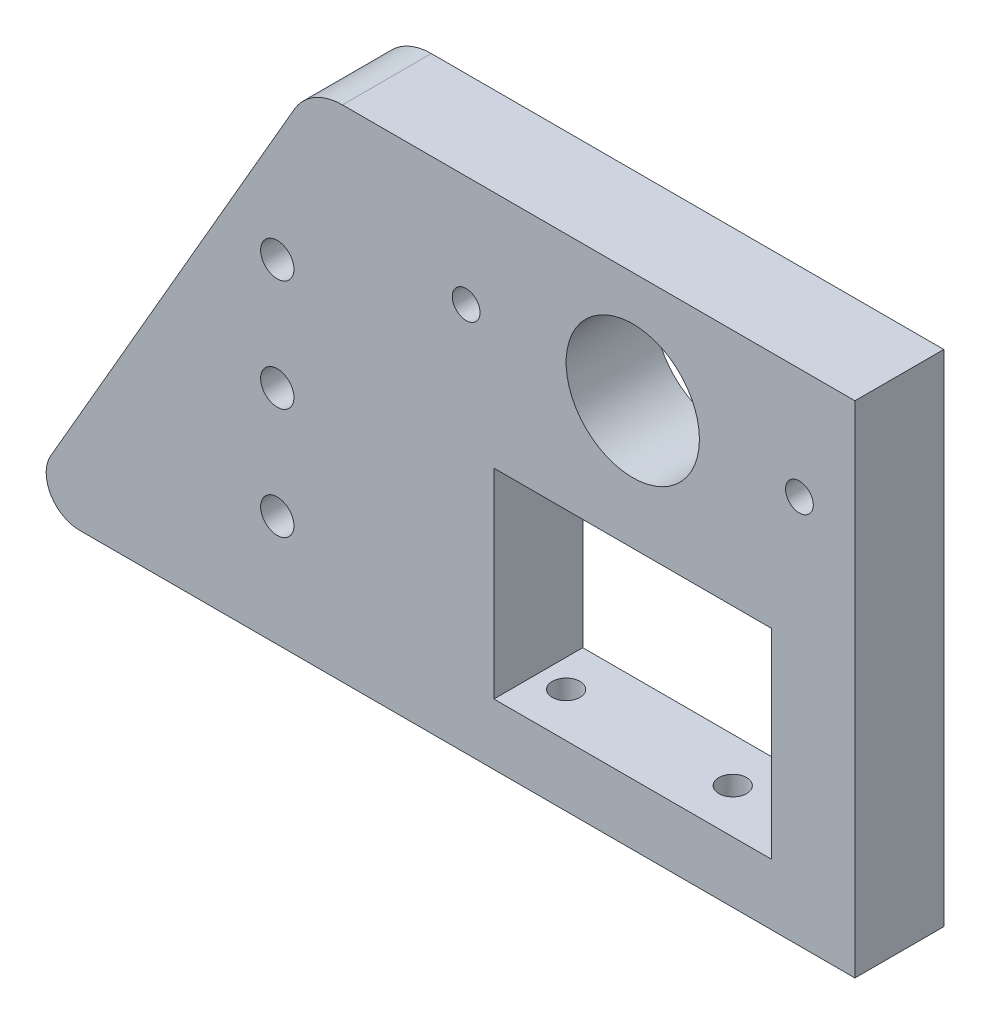
ISO-10303-21;
HEADER;
FILE_DESCRIPTION(('STEP AP214'),'2;1');
FILE_NAME('part.step','',(''),(''),'','','');
FILE_SCHEMA(('AUTOMOTIVE_DESIGN { 1 0 10303 214 1 1 1 1 }'));
ENDSEC;
DATA;
#1=APPLICATION_CONTEXT('core data for automotive mechanical design processes');
#2=APPLICATION_PROTOCOL_DEFINITION('international standard','automotive_design',2000,#1);
#3=PRODUCT_CONTEXT('',#1,'mechanical');
#4=PRODUCT('Part','Part','',(#3));
#5=PRODUCT_RELATED_PRODUCT_CATEGORY('part','',(#4));
#6=PRODUCT_DEFINITION_FORMATION('','',#4);
#7=PRODUCT_DEFINITION_CONTEXT('part definition',#1,'design');
#8=PRODUCT_DEFINITION('design','',#6,#7);
#9=PRODUCT_DEFINITION_SHAPE('','',#8);
#10=(LENGTH_UNIT() NAMED_UNIT(*) SI_UNIT(.MILLI.,.METRE.));
#11=(NAMED_UNIT(*) PLANE_ANGLE_UNIT() SI_UNIT($,.RADIAN.));
#12=(NAMED_UNIT(*) SI_UNIT($,.STERADIAN.) SOLID_ANGLE_UNIT());
#13=UNCERTAINTY_MEASURE_WITH_UNIT(LENGTH_MEASURE(1.E-05),#10,'distance_accuracy_value','');
#14=(GEOMETRIC_REPRESENTATION_CONTEXT(3) GLOBAL_UNCERTAINTY_ASSIGNED_CONTEXT((#13)) GLOBAL_UNIT_ASSIGNED_CONTEXT((#10,
#11,#12)) REPRESENTATION_CONTEXT('',''));
#15=CARTESIAN_POINT('',(0.,0.,0.));
#16=DIRECTION('',(0.,0.,1.));
#17=DIRECTION('',(1.,0.,0.));
#18=AXIS2_PLACEMENT_3D('',#15,#16,#17);
#19=CARTESIAN_POINT('',(-49.8038475772934,-32.,8.));
#20=DIRECTION('',(0.,0.,-1.));
#21=DIRECTION('',(-1.,0.,0.));
#22=AXIS2_PLACEMENT_3D('',#19,#20,#21);
#23=CYLINDRICAL_SURFACE('',#22,2.99999999999999);
#24=CARTESIAN_POINT('',(-49.8038475772934,-32.,0.));
#25=DIRECTION('',(0.,0.,1.));
#26=DIRECTION('',(1.,0.,0.));
#27=AXIS2_PLACEMENT_3D('',#24,#25,#26);
#28=CIRCLE('',#27,2.99999999999999);
#29=CARTESIAN_POINT('',(-49.8038475772934,-35.,0.));
#30=VERTEX_POINT('',#29);
#31=CARTESIAN_POINT('',(-52.4019237886466,-30.5,0.));
#32=VERTEX_POINT('',#31);
#33=EDGE_CURVE('E177',#30,#32,#28,.F.);
#34=ORIENTED_EDGE('',*,*,#33,.F.);
#35=DIRECTION('',(0.,0.,-1.));
#36=VECTOR('',#35,1.);
#37=CARTESIAN_POINT('',(-49.8038475772934,-35.,8.));
#38=LINE('',#37,#36);
#39=CARTESIAN_POINT('',(-49.8038475772934,-35.,8.));
#40=VERTEX_POINT('',#39);
#41=EDGE_CURVE('E11',#40,#30,#38,.T.);
#42=ORIENTED_EDGE('',*,*,#41,.F.);
#43=CARTESIAN_POINT('',(-49.8038475772934,-32.,8.));
#44=DIRECTION('',(0.,0.,1.));
#45=DIRECTION('',(1.,0.,0.));
#46=AXIS2_PLACEMENT_3D('',#43,#44,#45);
#47=CIRCLE('',#46,2.99999999999999);
#48=CARTESIAN_POINT('',(-52.4019237886466,-30.5,8.));
#49=VERTEX_POINT('',#48);
#50=EDGE_CURVE('E236',#40,#49,#47,.F.);
#51=ORIENTED_EDGE('',*,*,#50,.T.);
#52=DIRECTION('',(0.,0.,-1.));
#53=VECTOR('',#52,1.);
#54=CARTESIAN_POINT('',(-52.4019237886466,-30.5,8.));
#55=LINE('',#54,#53);
#56=EDGE_CURVE('E57',#49,#32,#55,.T.);
#57=ORIENTED_EDGE('',*,*,#56,.T.);
#58=EDGE_LOOP('',(#34,#42,#51,#57));
#59=FACE_BOUND('',#58,.T.);
#60=ADVANCED_FACE('F38',(#59),#23,.T.);
#61=CARTESIAN_POINT('',(0.,-35.,8.));
#62=DIRECTION('',(0.,1.,0.));
#63=DIRECTION('',(0.,0.,1.));
#64=AXIS2_PLACEMENT_3D('',#61,#62,#63);
#65=PLANE('',#64);
#66=CARTESIAN_POINT('',(-25.,-35.,4.));
#67=DIRECTION('',(0.,-1.,0.));
#68=DIRECTION('',(0.,0.,-1.));
#69=AXIS2_PLACEMENT_3D('',#66,#67,#68);
#70=CIRCLE('',#69,1.525);
#71=CARTESIAN_POINT('',(-25.,-35.,2.475));
#72=VERTEX_POINT('',#71);
#73=EDGE_CURVE('E389',#72,#72,#70,.T.);
#74=ORIENTED_EDGE('',*,*,#73,.F.);
#75=EDGE_LOOP('',(#74));
#76=FACE_BOUND('',#75,.T.);
#77=CARTESIAN_POINT('',(5.,-35.,4.));
#78=DIRECTION('',(0.,-1.,0.));
#79=DIRECTION('',(0.,0.,-1.));
#80=AXIS2_PLACEMENT_3D('',#77,#78,#79);
#81=CIRCLE('',#80,1.525);
#82=CARTESIAN_POINT('',(5.,-35.,2.475));
#83=VERTEX_POINT('',#82);
#84=EDGE_CURVE('E398',#83,#83,#81,.T.);
#85=ORIENTED_EDGE('',*,*,#84,.F.);
#86=EDGE_LOOP('',(#85));
#87=FACE_BOUND('',#86,.T.);
#88=CARTESIAN_POINT('',(-10.,-35.,4.));
#89=DIRECTION('',(0.,-1.,0.));
#90=DIRECTION('',(0.,0.,-1.));
#91=AXIS2_PLACEMENT_3D('',#88,#89,#90);
#92=CIRCLE('',#91,1.525);
#93=CARTESIAN_POINT('',(-10.,-35.,2.475));
#94=VERTEX_POINT('',#93);
#95=EDGE_CURVE('E207',#94,#94,#92,.T.);
#96=ORIENTED_EDGE('',*,*,#95,.F.);
#97=EDGE_LOOP('',(#96));
#98=FACE_BOUND('',#97,.T.);
#99=DIRECTION('',(1.,0.,0.));
#100=VECTOR('',#99,1.);
#101=CARTESIAN_POINT('',(0.,-35.,0.));
#102=LINE('',#101,#100);
#103=CARTESIAN_POINT('',(20.,-35.,0.));
#104=VERTEX_POINT('',#103);
#105=EDGE_CURVE('E179',#30,#104,#102,.T.);
#106=ORIENTED_EDGE('',*,*,#105,.T.);
#107=DIRECTION('',(0.,0.,-1.));
#108=VECTOR('',#107,1.);
#109=CARTESIAN_POINT('',(20.,-35.,8.));
#110=LINE('',#109,#108);
#111=CARTESIAN_POINT('',(20.,-35.,8.));
#112=VERTEX_POINT('',#111);
#113=EDGE_CURVE('E48',#112,#104,#110,.T.);
#114=ORIENTED_EDGE('',*,*,#113,.F.);
#115=DIRECTION('',(1.,0.,0.));
#116=VECTOR('',#115,1.);
#117=CARTESIAN_POINT('',(0.,-35.,8.));
#118=LINE('',#117,#116);
#119=EDGE_CURVE('E238',#40,#112,#118,.T.);
#120=ORIENTED_EDGE('',*,*,#119,.F.);
#121=ORIENTED_EDGE('',*,*,#41,.T.);
#122=EDGE_LOOP('',(#106,#114,#120,#121));
#123=FACE_BOUND('',#122,.T.);
#124=ADVANCED_FACE('F262',(#76,#87,#98,#123),#65,.F.);
#125=CARTESIAN_POINT('',(20.,0.,8.));
#126=DIRECTION('',(1.,0.,0.));
#127=DIRECTION('',(0.,1.,0.));
#128=AXIS2_PLACEMENT_3D('',#125,#126,#127);
#129=PLANE('',#128);
#130=DIRECTION('',(0.,-1.,0.));
#131=VECTOR('',#130,1.);
#132=CARTESIAN_POINT('',(20.,0.,0.));
#133=LINE('',#132,#131);
#134=CARTESIAN_POINT('',(20.,10.,0.));
#135=VERTEX_POINT('',#134);
#136=EDGE_CURVE('E182',#135,#104,#133,.T.);
#137=ORIENTED_EDGE('',*,*,#136,.F.);
#138=DIRECTION('',(0.,0.,-1.));
#139=VECTOR('',#138,1.);
#140=CARTESIAN_POINT('',(20.,10.,8.));
#141=LINE('',#140,#139);
#142=CARTESIAN_POINT('',(20.,10.,8.));
#143=VERTEX_POINT('',#142);
#144=EDGE_CURVE('E134',#143,#135,#141,.T.);
#145=ORIENTED_EDGE('',*,*,#144,.F.);
#146=DIRECTION('',(0.,-1.,0.));
#147=VECTOR('',#146,1.);
#148=CARTESIAN_POINT('',(20.,0.,8.));
#149=LINE('',#148,#147);
#150=EDGE_CURVE('E144',#143,#112,#149,.T.);
#151=ORIENTED_EDGE('',*,*,#150,.T.);
#152=ORIENTED_EDGE('',*,*,#113,.T.);
#153=EDGE_LOOP('',(#137,#145,#151,#152));
#154=FACE_BOUND('',#153,.T.);
#155=ADVANCED_FACE('F241',(#154),#129,.T.);
#156=CARTESIAN_POINT('',(0.,10.,8.));
#157=DIRECTION('',(0.,1.,0.));
#158=DIRECTION('',(0.,0.,1.));
#159=AXIS2_PLACEMENT_3D('',#156,#157,#158);
#160=PLANE('',#159);
#161=DIRECTION('',(1.,0.,0.));
#162=VECTOR('',#161,1.);
#163=CARTESIAN_POINT('',(0.,10.,0.));
#164=LINE('',#163,#162);
#165=CARTESIAN_POINT('',(-26.1324865405185,10.,0.));
#166=VERTEX_POINT('',#165);
#167=EDGE_CURVE('E130',#166,#135,#164,.T.);
#168=ORIENTED_EDGE('',*,*,#167,.F.);
#169=DIRECTION('',(0.,0.,-1.));
#170=VECTOR('',#169,1.);
#171=CARTESIAN_POINT('',(-26.1324865405185,10.,8.));
#172=LINE('',#171,#170);
#173=CARTESIAN_POINT('',(-26.1324865405185,10.,8.));
#174=VERTEX_POINT('',#173);
#175=EDGE_CURVE('E125',#174,#166,#172,.T.);
#176=ORIENTED_EDGE('',*,*,#175,.F.);
#177=DIRECTION('',(1.,0.,0.));
#178=VECTOR('',#177,1.);
#179=CARTESIAN_POINT('',(0.,10.,8.));
#180=LINE('',#179,#178);
#181=EDGE_CURVE('E128',#174,#143,#180,.T.);
#182=ORIENTED_EDGE('',*,*,#181,.T.);
#183=ORIENTED_EDGE('',*,*,#144,.T.);
#184=EDGE_LOOP('',(#168,#176,#182,#183));
#185=FACE_BOUND('',#184,.T.);
#186=ADVANCED_FACE('F127',(#185),#160,.T.);
#187=CARTESIAN_POINT('',(-26.1324865405185,5.,8.));
#188=DIRECTION('',(0.,0.,-1.));
#189=DIRECTION('',(-1.,0.,0.));
#190=AXIS2_PLACEMENT_3D('',#187,#188,#189);
#191=CYLINDRICAL_SURFACE('',#190,5.);
#192=CARTESIAN_POINT('',(-26.1324865405185,5.,0.));
#193=DIRECTION('',(0.,0.,1.));
#194=DIRECTION('',(1.,0.,0.));
#195=AXIS2_PLACEMENT_3D('',#192,#193,#194);
#196=CIRCLE('',#195,5.);
#197=CARTESIAN_POINT('',(-30.4626135594406,7.50000000000002,0.));
#198=VERTEX_POINT('',#197);
#199=EDGE_CURVE('E186',#198,#166,#196,.F.);
#200=ORIENTED_EDGE('',*,*,#199,.F.);
#201=DIRECTION('',(0.,0.,-1.));
#202=VECTOR('',#201,1.);
#203=CARTESIAN_POINT('',(-30.4626135594406,7.50000000000002,8.));
#204=LINE('',#203,#202);
#205=CARTESIAN_POINT('',(-30.4626135594406,7.50000000000002,8.));
#206=VERTEX_POINT('',#205);
#207=EDGE_CURVE('E89',#206,#198,#204,.T.);
#208=ORIENTED_EDGE('',*,*,#207,.F.);
#209=CARTESIAN_POINT('',(-26.1324865405185,5.,8.));
#210=DIRECTION('',(0.,0.,1.));
#211=DIRECTION('',(1.,0.,0.));
#212=AXIS2_PLACEMENT_3D('',#209,#210,#211);
#213=CIRCLE('',#212,5.);
#214=EDGE_CURVE('E142',#206,#174,#213,.F.);
#215=ORIENTED_EDGE('',*,*,#214,.T.);
#216=ORIENTED_EDGE('',*,*,#175,.T.);
#217=EDGE_LOOP('',(#200,#208,#215,#216));
#218=FACE_BOUND('',#217,.T.);
#219=ADVANCED_FACE('F146',(#218),#191,.T.);
#220=CARTESIAN_POINT('',(-12.5,0.,8.));
#221=DIRECTION('',(-1.,0.,0.));
#222=DIRECTION('',(0.,0.,1.));
#223=AXIS2_PLACEMENT_3D('',#220,#221,#222);
#224=PLANE('',#223);
#225=DIRECTION('',(0.,1.,0.));
#226=VECTOR('',#225,1.);
#227=CARTESIAN_POINT('',(-12.5,0.,0.));
#228=LINE('',#227,#226);
#229=CARTESIAN_POINT('',(-12.5,-29.5,0.));
#230=VERTEX_POINT('',#229);
#231=CARTESIAN_POINT('',(-12.5,-11.5,0.));
#232=VERTEX_POINT('',#231);
#233=EDGE_CURVE('E153',#230,#232,#228,.T.);
#234=ORIENTED_EDGE('',*,*,#233,.T.);
#235=DIRECTION('',(0.,0.,-1.));
#236=VECTOR('',#235,1.);
#237=CARTESIAN_POINT('',(-12.5,-11.5,8.));
#238=LINE('',#237,#236);
#239=CARTESIAN_POINT('',(-12.5,-11.5,8.));
#240=VERTEX_POINT('',#239);
#241=EDGE_CURVE('E192',#240,#232,#238,.T.);
#242=ORIENTED_EDGE('',*,*,#241,.F.);
#243=DIRECTION('',(0.,1.,0.));
#244=VECTOR('',#243,1.);
#245=CARTESIAN_POINT('',(-12.5,0.,8.));
#246=LINE('',#245,#244);
#247=CARTESIAN_POINT('',(-12.5,-29.5,8.));
#248=VERTEX_POINT('',#247);
#249=EDGE_CURVE('E102',#248,#240,#246,.T.);
#250=ORIENTED_EDGE('',*,*,#249,.F.);
#251=DIRECTION('',(0.,0.,-1.));
#252=VECTOR('',#251,1.);
#253=CARTESIAN_POINT('',(-12.5,-29.5,8.));
#254=LINE('',#253,#252);
#255=EDGE_CURVE('E149',#248,#230,#254,.T.);
#256=ORIENTED_EDGE('',*,*,#255,.T.);
#257=EDGE_LOOP('',(#234,#242,#250,#256));
#258=FACE_BOUND('',#257,.T.);
#259=ADVANCED_FACE('F40',(#258),#224,.F.);
#260=CARTESIAN_POINT('',(0.,-11.5,8.));
#261=DIRECTION('',(0.,-1.,0.));
#262=DIRECTION('',(1.,0.,0.));
#263=AXIS2_PLACEMENT_3D('',#260,#261,#262);
#264=PLANE('',#263);
#265=DIRECTION('',(-1.,0.,0.));
#266=VECTOR('',#265,1.);
#267=CARTESIAN_POINT('',(0.,-11.5,0.));
#268=LINE('',#267,#266);
#269=CARTESIAN_POINT('',(12.5,-11.5,0.));
#270=VERTEX_POINT('',#269);
#271=EDGE_CURVE('E156',#270,#232,#268,.T.);
#272=ORIENTED_EDGE('',*,*,#271,.F.);
#273=DIRECTION('',(0.,0.,-1.));
#274=VECTOR('',#273,1.);
#275=CARTESIAN_POINT('',(12.5,-11.5,8.));
#276=LINE('',#275,#274);
#277=CARTESIAN_POINT('',(12.5,-11.5,8.));
#278=VERTEX_POINT('',#277);
#279=EDGE_CURVE('E200',#278,#270,#276,.T.);
#280=ORIENTED_EDGE('',*,*,#279,.F.);
#281=DIRECTION('',(-1.,0.,0.));
#282=VECTOR('',#281,1.);
#283=CARTESIAN_POINT('',(0.,-11.5,8.));
#284=LINE('',#283,#282);
#285=EDGE_CURVE('E216',#278,#240,#284,.T.);
#286=ORIENTED_EDGE('',*,*,#285,.T.);
#287=ORIENTED_EDGE('',*,*,#241,.T.);
#288=EDGE_LOOP('',(#272,#280,#286,#287));
#289=FACE_BOUND('',#288,.T.);
#290=ADVANCED_FACE('F288',(#289),#264,.T.);
#291=CARTESIAN_POINT('',(12.5,0.,8.));
#292=DIRECTION('',(-1.,0.,0.));
#293=DIRECTION('',(0.,0.,1.));
#294=AXIS2_PLACEMENT_3D('',#291,#292,#293);
#295=PLANE('',#294);
#296=DIRECTION('',(0.,1.,0.));
#297=VECTOR('',#296,1.);
#298=CARTESIAN_POINT('',(12.5,0.,0.));
#299=LINE('',#298,#297);
#300=CARTESIAN_POINT('',(12.5,-29.5,0.));
#301=VERTEX_POINT('',#300);
#302=EDGE_CURVE('E160',#301,#270,#299,.T.);
#303=ORIENTED_EDGE('',*,*,#302,.F.);
#304=DIRECTION('',(0.,0.,-1.));
#305=VECTOR('',#304,1.);
#306=CARTESIAN_POINT('',(12.5,-29.5,8.));
#307=LINE('',#306,#305);
#308=CARTESIAN_POINT('',(12.5,-29.5,8.));
#309=VERTEX_POINT('',#308);
#310=EDGE_CURVE('E198',#309,#301,#307,.T.);
#311=ORIENTED_EDGE('',*,*,#310,.F.);
#312=DIRECTION('',(0.,1.,0.));
#313=VECTOR('',#312,1.);
#314=CARTESIAN_POINT('',(12.5,0.,8.));
#315=LINE('',#314,#313);
#316=EDGE_CURVE('E219',#309,#278,#315,.T.);
#317=ORIENTED_EDGE('',*,*,#316,.T.);
#318=ORIENTED_EDGE('',*,*,#279,.T.);
#319=EDGE_LOOP('',(#303,#311,#317,#318));
#320=FACE_BOUND('',#319,.T.);
#321=ADVANCED_FACE('F275',(#320),#295,.T.);
#322=CARTESIAN_POINT('',(0.,0.,8.));
#323=DIRECTION('',(0.,0.,-1.));
#324=DIRECTION('',(-1.,0.,0.));
#325=AXIS2_PLACEMENT_3D('',#322,#323,#324);
#326=CYLINDRICAL_SURFACE('',#325,6.);
#327=CARTESIAN_POINT('',(0.,0.,8.));
#328=DIRECTION('',(0.,0.,1.));
#329=DIRECTION('',(1.,0.,0.));
#330=AXIS2_PLACEMENT_3D('',#327,#328,#329);
#331=CIRCLE('',#330,6.);
#332=CARTESIAN_POINT('',(6.,0.,8.));
#333=VERTEX_POINT('',#332);
#334=EDGE_CURVE('E233',#333,#333,#331,.T.);
#335=ORIENTED_EDGE('',*,*,#334,.T.);
#336=EDGE_LOOP('',(#335));
#337=FACE_BOUND('',#336,.T.);
#338=CARTESIAN_POINT('',(0.,0.,0.));
#339=DIRECTION('',(0.,0.,1.));
#340=DIRECTION('',(1.,0.,0.));
#341=AXIS2_PLACEMENT_3D('',#338,#339,#340);
#342=CIRCLE('',#341,6.);
#343=CARTESIAN_POINT('',(6.,0.,0.));
#344=VERTEX_POINT('',#343);
#345=EDGE_CURVE('E174',#344,#344,#342,.T.);
#346=ORIENTED_EDGE('',*,*,#345,.F.);
#347=EDGE_LOOP('',(#346));
#348=FACE_BOUND('',#347,.T.);
#349=ADVANCED_FACE('F271',(#337,#348),#326,.F.);
#350=CARTESIAN_POINT('',(-32.,-5.00000000000001,8.));
#351=DIRECTION('',(0.,0.,-1.));
#352=DIRECTION('',(-1.,0.,0.));
#353=AXIS2_PLACEMENT_3D('',#350,#351,#352);
#354=CYLINDRICAL_SURFACE('',#353,1.5);
#355=CARTESIAN_POINT('',(-32.,-5.00000000000001,8.));
#356=DIRECTION('',(0.,0.,1.));
#357=DIRECTION('',(1.,0.,0.));
#358=AXIS2_PLACEMENT_3D('',#355,#356,#357);
#359=CIRCLE('',#358,1.5);
#360=CARTESIAN_POINT('',(-30.5,-5.00000000000001,8.));
#361=VERTEX_POINT('',#360);
#362=EDGE_CURVE('E230',#361,#361,#359,.T.);
#363=ORIENTED_EDGE('',*,*,#362,.T.);
#364=EDGE_LOOP('',(#363));
#365=FACE_BOUND('',#364,.T.);
#366=CARTESIAN_POINT('',(-32.,-5.00000000000001,0.));
#367=DIRECTION('',(0.,0.,1.));
#368=DIRECTION('',(1.,0.,0.));
#369=AXIS2_PLACEMENT_3D('',#366,#367,#368);
#370=CIRCLE('',#369,1.5);
#371=CARTESIAN_POINT('',(-30.5,-5.00000000000001,0.));
#372=VERTEX_POINT('',#371);
#373=EDGE_CURVE('E171',#372,#372,#370,.T.);
#374=ORIENTED_EDGE('',*,*,#373,.F.);
#375=EDGE_LOOP('',(#374));
#376=FACE_BOUND('',#375,.T.);
#377=ADVANCED_FACE('F274',(#365,#376),#354,.F.);
#378=CARTESIAN_POINT('',(-32.,-15.,8.));
#379=DIRECTION('',(0.,0.,-1.));
#380=DIRECTION('',(-1.,0.,0.));
#381=AXIS2_PLACEMENT_3D('',#378,#379,#380);
#382=CYLINDRICAL_SURFACE('',#381,1.5);
#383=CARTESIAN_POINT('',(-32.,-15.,8.));
#384=DIRECTION('',(0.,0.,1.));
#385=DIRECTION('',(1.,0.,0.));
#386=AXIS2_PLACEMENT_3D('',#383,#384,#385);
#387=CIRCLE('',#386,1.5);
#388=CARTESIAN_POINT('',(-30.5,-15.,8.));
#389=VERTEX_POINT('',#388);
#390=EDGE_CURVE('E227',#389,#389,#387,.T.);
#391=ORIENTED_EDGE('',*,*,#390,.T.);
#392=EDGE_LOOP('',(#391));
#393=FACE_BOUND('',#392,.T.);
#394=CARTESIAN_POINT('',(-32.,-15.,0.));
#395=DIRECTION('',(0.,0.,1.));
#396=DIRECTION('',(1.,0.,0.));
#397=AXIS2_PLACEMENT_3D('',#394,#395,#396);
#398=CIRCLE('',#397,1.5);
#399=CARTESIAN_POINT('',(-30.5,-15.,0.));
#400=VERTEX_POINT('',#399);
#401=EDGE_CURVE('E168',#400,#400,#398,.T.);
#402=ORIENTED_EDGE('',*,*,#401,.F.);
#403=EDGE_LOOP('',(#402));
#404=FACE_BOUND('',#403,.T.);
#405=ADVANCED_FACE('F279',(#393,#404),#382,.F.);
#406=CARTESIAN_POINT('',(-32.,-25.,8.));
#407=DIRECTION('',(0.,0.,-1.));
#408=DIRECTION('',(-1.,0.,0.));
#409=AXIS2_PLACEMENT_3D('',#406,#407,#408);
#410=CYLINDRICAL_SURFACE('',#409,1.5);
#411=CARTESIAN_POINT('',(-32.,-25.,8.));
#412=DIRECTION('',(0.,0.,1.));
#413=DIRECTION('',(1.,0.,0.));
#414=AXIS2_PLACEMENT_3D('',#411,#412,#413);
#415=CIRCLE('',#414,1.5);
#416=CARTESIAN_POINT('',(-30.5,-25.,8.));
#417=VERTEX_POINT('',#416);
#418=EDGE_CURVE('E224',#417,#417,#415,.T.);
#419=ORIENTED_EDGE('',*,*,#418,.T.);
#420=EDGE_LOOP('',(#419));
#421=FACE_BOUND('',#420,.T.);
#422=CARTESIAN_POINT('',(-32.,-25.,0.));
#423=DIRECTION('',(0.,0.,1.));
#424=DIRECTION('',(1.,0.,0.));
#425=AXIS2_PLACEMENT_3D('',#422,#423,#424);
#426=CIRCLE('',#425,1.5);
#427=CARTESIAN_POINT('',(-30.5,-25.,0.));
#428=VERTEX_POINT('',#427);
#429=EDGE_CURVE('E165',#428,#428,#426,.T.);
#430=ORIENTED_EDGE('',*,*,#429,.F.);
#431=EDGE_LOOP('',(#430));
#432=FACE_BOUND('',#431,.T.);
#433=ADVANCED_FACE('F256',(#421,#432),#410,.F.);
#434=CARTESIAN_POINT('',(0.,-29.5,8.));
#435=DIRECTION('',(0.,-1.,0.));
#436=DIRECTION('',(1.,0.,0.));
#437=AXIS2_PLACEMENT_3D('',#434,#435,#436);
#438=PLANE('',#437);
#439=CARTESIAN_POINT('',(5.,-29.5,4.));
#440=DIRECTION('',(0.,-1.,0.));
#441=DIRECTION('',(1.,0.,0.));
#442=AXIS2_PLACEMENT_3D('',#439,#440,#441);
#443=CIRCLE('',#442,1.25);
#444=CARTESIAN_POINT('',(6.25,-29.5,4.));
#445=VERTEX_POINT('',#444);
#446=EDGE_CURVE('E42',#445,#445,#443,.T.);
#447=ORIENTED_EDGE('',*,*,#446,.T.);
#448=EDGE_LOOP('',(#447));
#449=FACE_BOUND('',#448,.T.);
#450=CARTESIAN_POINT('',(-10.,-29.5,4.));
#451=DIRECTION('',(0.,-1.,0.));
#452=DIRECTION('',(1.,0.,0.));
#453=AXIS2_PLACEMENT_3D('',#450,#451,#452);
#454=CIRCLE('',#453,1.25);
#455=CARTESIAN_POINT('',(-8.75,-29.5,4.));
#456=VERTEX_POINT('',#455);
#457=EDGE_CURVE('E157',#456,#456,#454,.T.);
#458=ORIENTED_EDGE('',*,*,#457,.T.);
#459=EDGE_LOOP('',(#458));
#460=FACE_BOUND('',#459,.T.);
#461=DIRECTION('',(-1.,0.,0.));
#462=VECTOR('',#461,1.);
#463=CARTESIAN_POINT('',(0.,-29.5,0.));
#464=LINE('',#463,#462);
#465=EDGE_CURVE('E163',#301,#230,#464,.T.);
#466=ORIENTED_EDGE('',*,*,#465,.T.);
#467=ORIENTED_EDGE('',*,*,#255,.F.);
#468=DIRECTION('',(-1.,0.,0.));
#469=VECTOR('',#468,1.);
#470=CARTESIAN_POINT('',(0.,-29.5,8.));
#471=LINE('',#470,#469);
#472=EDGE_CURVE('E222',#309,#248,#471,.T.);
#473=ORIENTED_EDGE('',*,*,#472,.F.);
#474=ORIENTED_EDGE('',*,*,#310,.T.);
#475=EDGE_LOOP('',(#466,#467,#473,#474));
#476=FACE_BOUND('',#475,.T.);
#477=ADVANCED_FACE('F248',(#449,#460,#476),#438,.F.);
#478=CARTESIAN_POINT('',(-26.094555433772,15.065698604072,8.));
#479=DIRECTION('',(-0.866025403784436,0.500000000000004,0.));
#480=DIRECTION('',(-0.500000000000004,-0.866025403784436,0.));
#481=AXIS2_PLACEMENT_3D('',#478,#479,#480);
#482=PLANE('',#481);
#483=DIRECTION('',(0.500000000000004,0.866025403784436,0.));
#484=VECTOR('',#483,1.);
#485=CARTESIAN_POINT('',(-26.094555433772,15.065698604072,0.));
#486=LINE('',#485,#484);
#487=EDGE_CURVE('E188',#32,#198,#486,.T.);
#488=ORIENTED_EDGE('',*,*,#487,.F.);
#489=ORIENTED_EDGE('',*,*,#56,.F.);
#490=DIRECTION('',(0.500000000000004,0.866025403784436,0.));
#491=VECTOR('',#490,1.);
#492=CARTESIAN_POINT('',(-26.094555433772,15.065698604072,8.));
#493=LINE('',#492,#491);
#494=EDGE_CURVE('E147',#49,#206,#493,.T.);
#495=ORIENTED_EDGE('',*,*,#494,.T.);
#496=ORIENTED_EDGE('',*,*,#207,.T.);
#497=EDGE_LOOP('',(#488,#489,#495,#496));
#498=FACE_BOUND('',#497,.T.);
#499=ADVANCED_FACE('F246',(#498),#482,.T.);
#500=CARTESIAN_POINT('',(0.,0.,8.));
#501=DIRECTION('',(0.,0.,1.));
#502=DIRECTION('',(1.,0.,0.));
#503=AXIS2_PLACEMENT_3D('',#500,#501,#502);
#504=PLANE('',#503);
#505=CARTESIAN_POINT('',(-15.,0.,8.));
#506=DIRECTION('',(0.,0.,-1.));
#507=DIRECTION('',(-1.,0.,0.));
#508=AXIS2_PLACEMENT_3D('',#505,#506,#507);
#509=CIRCLE('',#508,1.25);
#510=CARTESIAN_POINT('',(-16.25,0.,8.));
#511=VERTEX_POINT('',#510);
#512=EDGE_CURVE('E375',#511,#511,#509,.T.);
#513=ORIENTED_EDGE('',*,*,#512,.T.);
#514=EDGE_LOOP('',(#513));
#515=FACE_BOUND('',#514,.T.);
#516=CARTESIAN_POINT('',(15.,0.,8.));
#517=DIRECTION('',(0.,0.,-1.));
#518=DIRECTION('',(-1.,0.,0.));
#519=AXIS2_PLACEMENT_3D('',#516,#517,#518);
#520=CIRCLE('',#519,1.25);
#521=CARTESIAN_POINT('',(13.75,0.,8.));
#522=VERTEX_POINT('',#521);
#523=EDGE_CURVE('E386',#522,#522,#520,.T.);
#524=ORIENTED_EDGE('',*,*,#523,.T.);
#525=EDGE_LOOP('',(#524));
#526=FACE_BOUND('',#525,.T.);
#527=ORIENTED_EDGE('',*,*,#249,.T.);
#528=ORIENTED_EDGE('',*,*,#285,.F.);
#529=ORIENTED_EDGE('',*,*,#316,.F.);
#530=ORIENTED_EDGE('',*,*,#472,.T.);
#531=EDGE_LOOP('',(#527,#528,#529,#530));
#532=FACE_BOUND('',#531,.T.);
#533=ORIENTED_EDGE('',*,*,#418,.F.);
#534=EDGE_LOOP('',(#533));
#535=FACE_BOUND('',#534,.T.);
#536=ORIENTED_EDGE('',*,*,#390,.F.);
#537=EDGE_LOOP('',(#536));
#538=FACE_BOUND('',#537,.T.);
#539=ORIENTED_EDGE('',*,*,#362,.F.);
#540=EDGE_LOOP('',(#539));
#541=FACE_BOUND('',#540,.T.);
#542=ORIENTED_EDGE('',*,*,#334,.F.);
#543=EDGE_LOOP('',(#542));
#544=FACE_BOUND('',#543,.T.);
#545=ORIENTED_EDGE('',*,*,#50,.F.);
#546=ORIENTED_EDGE('',*,*,#119,.T.);
#547=ORIENTED_EDGE('',*,*,#150,.F.);
#548=ORIENTED_EDGE('',*,*,#181,.F.);
#549=ORIENTED_EDGE('',*,*,#214,.F.);
#550=ORIENTED_EDGE('',*,*,#494,.F.);
#551=EDGE_LOOP('',(#545,#546,#547,#548,#549,#550));
#552=FACE_BOUND('',#551,.T.);
#553=ADVANCED_FACE('F140',(#515,#526,#532,#535,#538,#541,#544,#552),#504,.T.);
#554=CARTESIAN_POINT('',(0.,0.,0.));
#555=DIRECTION('',(0.,0.,1.));
#556=DIRECTION('',(1.,0.,0.));
#557=AXIS2_PLACEMENT_3D('',#554,#555,#556);
#558=PLANE('',#557);
#559=CARTESIAN_POINT('',(-15.,0.,0.));
#560=DIRECTION('',(0.,0.,-1.));
#561=DIRECTION('',(-1.,0.,0.));
#562=AXIS2_PLACEMENT_3D('',#559,#560,#561);
#563=CIRCLE('',#562,1.525);
#564=CARTESIAN_POINT('',(-16.525,0.,0.));
#565=VERTEX_POINT('',#564);
#566=EDGE_CURVE('E373',#565,#565,#563,.T.);
#567=ORIENTED_EDGE('',*,*,#566,.F.);
#568=EDGE_LOOP('',(#567));
#569=FACE_BOUND('',#568,.T.);
#570=CARTESIAN_POINT('',(15.,0.,0.));
#571=DIRECTION('',(0.,0.,-1.));
#572=DIRECTION('',(-1.,0.,0.));
#573=AXIS2_PLACEMENT_3D('',#570,#571,#572);
#574=CIRCLE('',#573,1.525);
#575=CARTESIAN_POINT('',(13.475,0.,0.));
#576=VERTEX_POINT('',#575);
#577=EDGE_CURVE('E380',#576,#576,#574,.T.);
#578=ORIENTED_EDGE('',*,*,#577,.F.);
#579=EDGE_LOOP('',(#578));
#580=FACE_BOUND('',#579,.T.);
#581=ORIENTED_EDGE('',*,*,#233,.F.);
#582=ORIENTED_EDGE('',*,*,#465,.F.);
#583=ORIENTED_EDGE('',*,*,#302,.T.);
#584=ORIENTED_EDGE('',*,*,#271,.T.);
#585=EDGE_LOOP('',(#581,#582,#583,#584));
#586=FACE_BOUND('',#585,.T.);
#587=ORIENTED_EDGE('',*,*,#429,.T.);
#588=EDGE_LOOP('',(#587));
#589=FACE_BOUND('',#588,.T.);
#590=ORIENTED_EDGE('',*,*,#401,.T.);
#591=EDGE_LOOP('',(#590));
#592=FACE_BOUND('',#591,.T.);
#593=ORIENTED_EDGE('',*,*,#373,.T.);
#594=EDGE_LOOP('',(#593));
#595=FACE_BOUND('',#594,.T.);
#596=ORIENTED_EDGE('',*,*,#345,.T.);
#597=EDGE_LOOP('',(#596));
#598=FACE_BOUND('',#597,.T.);
#599=ORIENTED_EDGE('',*,*,#33,.T.);
#600=ORIENTED_EDGE('',*,*,#487,.T.);
#601=ORIENTED_EDGE('',*,*,#199,.T.);
#602=ORIENTED_EDGE('',*,*,#167,.T.);
#603=ORIENTED_EDGE('',*,*,#136,.T.);
#604=ORIENTED_EDGE('',*,*,#105,.F.);
#605=EDGE_LOOP('',(#599,#600,#601,#602,#603,#604));
#606=FACE_BOUND('',#605,.T.);
#607=ADVANCED_FACE('F245',(#569,#580,#586,#589,#592,#595,#598,#606),#558,.F.);
#608=CARTESIAN_POINT('',(-10.,-35.,4.));
#609=DIRECTION('',(0.,-1.,0.));
#610=DIRECTION('',(0.,0.,-1.));
#611=AXIS2_PLACEMENT_3D('',#608,#609,#610);
#612=CYLINDRICAL_SURFACE('',#611,1.25);
#613=CARTESIAN_POINT('',(-10.,-34.3360912703474,4.));
#614=DIRECTION('',(0.,-1.,0.));
#615=DIRECTION('',(0.,0.,-1.));
#616=AXIS2_PLACEMENT_3D('',#613,#614,#615);
#617=CIRCLE('',#616,1.25);
#618=CARTESIAN_POINT('',(-10.,-34.3360912703474,2.75));
#619=VERTEX_POINT('',#618);
#620=EDGE_CURVE('E203',#619,#619,#617,.T.);
#621=ORIENTED_EDGE('',*,*,#620,.T.);
#622=EDGE_LOOP('',(#621));
#623=FACE_BOUND('',#622,.T.);
#624=ORIENTED_EDGE('',*,*,#457,.F.);
#625=EDGE_LOOP('',(#624));
#626=FACE_BOUND('',#625,.T.);
#627=ADVANCED_FACE('F318',(#623,#626),#612,.F.);
#628=CARTESIAN_POINT('',(-10.,-35.,4.));
#629=DIRECTION('',(0.,-1.,0.));
#630=DIRECTION('',(0.,0.,-1.));
#631=AXIS2_PLACEMENT_3D('',#628,#629,#630);
#632=CONICAL_SURFACE('',#631,1.525,0.392699081698722);
#633=ORIENTED_EDGE('',*,*,#620,.F.);
#634=EDGE_LOOP('',(#633));
#635=FACE_BOUND('',#634,.T.);
#636=ORIENTED_EDGE('',*,*,#95,.T.);
#637=EDGE_LOOP('',(#636));
#638=FACE_BOUND('',#637,.T.);
#639=ADVANCED_FACE('F323',(#635,#638),#632,.F.);
#640=CARTESIAN_POINT('',(5.,-35.,4.));
#641=DIRECTION('',(0.,-1.,0.));
#642=DIRECTION('',(0.,0.,-1.));
#643=AXIS2_PLACEMENT_3D('',#640,#641,#642);
#644=CYLINDRICAL_SURFACE('',#643,1.25);
#645=CARTESIAN_POINT('',(5.,-34.3360912703474,4.));
#646=DIRECTION('',(0.,-1.,0.));
#647=DIRECTION('',(0.,0.,-1.));
#648=AXIS2_PLACEMENT_3D('',#645,#646,#647);
#649=CIRCLE('',#648,1.25);
#650=CARTESIAN_POINT('',(5.,-34.3360912703474,2.75));
#651=VERTEX_POINT('',#650);
#652=EDGE_CURVE('E400',#651,#651,#649,.T.);
#653=ORIENTED_EDGE('',*,*,#652,.T.);
#654=EDGE_LOOP('',(#653));
#655=FACE_BOUND('',#654,.T.);
#656=ORIENTED_EDGE('',*,*,#446,.F.);
#657=EDGE_LOOP('',(#656));
#658=FACE_BOUND('',#657,.T.);
#659=ADVANCED_FACE('F330',(#655,#658),#644,.F.);
#660=CARTESIAN_POINT('',(5.,-35.,4.));
#661=DIRECTION('',(0.,-1.,0.));
#662=DIRECTION('',(0.,0.,-1.));
#663=AXIS2_PLACEMENT_3D('',#660,#661,#662);
#664=CONICAL_SURFACE('',#663,1.525,0.392699081698722);
#665=ORIENTED_EDGE('',*,*,#652,.F.);
#666=EDGE_LOOP('',(#665));
#667=FACE_BOUND('',#666,.T.);
#668=ORIENTED_EDGE('',*,*,#84,.T.);
#669=EDGE_LOOP('',(#668));
#670=FACE_BOUND('',#669,.T.);
#671=ADVANCED_FACE('F334',(#667,#670),#664,.F.);
#672=CARTESIAN_POINT('',(-25.,-28.2510757737845,4.));
#673=DIRECTION('',(0.,-1.,0.));
#674=DIRECTION('',(0.,0.,-1.));
#675=AXIS2_PLACEMENT_3D('',#672,#673,#674);
#676=CONICAL_SURFACE('',#675,1.25,1.02974425867665);
#677=CARTESIAN_POINT('',(-25.,-27.5,4.));
#678=VERTEX_POINT('',#677);
#679=VERTEX_LOOP('',#678);
#680=FACE_BOUND('',#679,.T.);
#681=CARTESIAN_POINT('',(-25.,-28.2510757737845,4.));
#682=DIRECTION('',(0.,-1.,0.));
#683=DIRECTION('',(0.,0.,-1.));
#684=AXIS2_PLACEMENT_3D('',#681,#682,#683);
#685=CIRCLE('',#684,1.25);
#686=CARTESIAN_POINT('',(-25.,-28.2510757737845,2.75));
#687=VERTEX_POINT('',#686);
#688=EDGE_CURVE('E395',#687,#687,#685,.T.);
#689=ORIENTED_EDGE('',*,*,#688,.T.);
#690=EDGE_LOOP('',(#689));
#691=FACE_BOUND('',#690,.T.);
#692=ADVANCED_FACE('F338',(#680,#691),#676,.F.);
#693=CARTESIAN_POINT('',(-25.,-35.,4.));
#694=DIRECTION('',(0.,-1.,0.));
#695=DIRECTION('',(0.,0.,-1.));
#696=AXIS2_PLACEMENT_3D('',#693,#694,#695);
#697=CYLINDRICAL_SURFACE('',#696,1.25);
#698=ORIENTED_EDGE('',*,*,#688,.F.);
#699=EDGE_LOOP('',(#698));
#700=FACE_BOUND('',#699,.T.);
#701=CARTESIAN_POINT('',(-25.,-34.3360912703474,4.));
#702=DIRECTION('',(0.,-1.,0.));
#703=DIRECTION('',(0.,0.,-1.));
#704=AXIS2_PLACEMENT_3D('',#701,#702,#703);
#705=CIRCLE('',#704,1.25);
#706=CARTESIAN_POINT('',(-25.,-34.3360912703474,2.75));
#707=VERTEX_POINT('',#706);
#708=EDGE_CURVE('E392',#707,#707,#705,.T.);
#709=ORIENTED_EDGE('',*,*,#708,.T.);
#710=EDGE_LOOP('',(#709));
#711=FACE_BOUND('',#710,.T.);
#712=ADVANCED_FACE('F342',(#700,#711),#697,.F.);
#713=CARTESIAN_POINT('',(-25.,-35.,4.));
#714=DIRECTION('',(0.,-1.,0.));
#715=DIRECTION('',(0.,0.,-1.));
#716=AXIS2_PLACEMENT_3D('',#713,#714,#715);
#717=CONICAL_SURFACE('',#716,1.525,0.392699081698722);
#718=ORIENTED_EDGE('',*,*,#708,.F.);
#719=EDGE_LOOP('',(#718));
#720=FACE_BOUND('',#719,.T.);
#721=ORIENTED_EDGE('',*,*,#73,.T.);
#722=EDGE_LOOP('',(#721));
#723=FACE_BOUND('',#722,.T.);
#724=ADVANCED_FACE('F346',(#720,#723),#717,.F.);
#725=CARTESIAN_POINT('',(15.,0.,0.));
#726=DIRECTION('',(0.,0.,-1.));
#727=DIRECTION('',(-1.,0.,0.));
#728=AXIS2_PLACEMENT_3D('',#725,#726,#727);
#729=CYLINDRICAL_SURFACE('',#728,1.25);
#730=ORIENTED_EDGE('',*,*,#523,.F.);
#731=EDGE_LOOP('',(#730));
#732=FACE_BOUND('',#731,.T.);
#733=CARTESIAN_POINT('',(15.,0.,0.663908729652601));
#734=DIRECTION('',(0.,0.,-1.));
#735=DIRECTION('',(-1.,0.,0.));
#736=AXIS2_PLACEMENT_3D('',#733,#734,#735);
#737=CIRCLE('',#736,1.25);
#738=CARTESIAN_POINT('',(13.75,0.,0.663908729652601));
#739=VERTEX_POINT('',#738);
#740=EDGE_CURVE('E383',#739,#739,#737,.T.);
#741=ORIENTED_EDGE('',*,*,#740,.T.);
#742=EDGE_LOOP('',(#741));
#743=FACE_BOUND('',#742,.T.);
#744=ADVANCED_FACE('F350',(#732,#743),#729,.F.);
#745=CARTESIAN_POINT('',(15.,0.,0.));
#746=DIRECTION('',(0.,0.,-1.));
#747=DIRECTION('',(-1.,0.,0.));
#748=AXIS2_PLACEMENT_3D('',#745,#746,#747);
#749=CONICAL_SURFACE('',#748,1.525,0.392699081698725);
#750=ORIENTED_EDGE('',*,*,#740,.F.);
#751=EDGE_LOOP('',(#750));
#752=FACE_BOUND('',#751,.T.);
#753=ORIENTED_EDGE('',*,*,#577,.T.);
#754=EDGE_LOOP('',(#753));
#755=FACE_BOUND('',#754,.T.);
#756=ADVANCED_FACE('F354',(#752,#755),#749,.F.);
#757=CARTESIAN_POINT('',(-15.,0.,0.));
#758=DIRECTION('',(0.,0.,-1.));
#759=DIRECTION('',(-1.,0.,0.));
#760=AXIS2_PLACEMENT_3D('',#757,#758,#759);
#761=CYLINDRICAL_SURFACE('',#760,1.25);
#762=ORIENTED_EDGE('',*,*,#512,.F.);
#763=EDGE_LOOP('',(#762));
#764=FACE_BOUND('',#763,.T.);
#765=CARTESIAN_POINT('',(-15.,0.,0.663908729652601));
#766=DIRECTION('',(0.,0.,-1.));
#767=DIRECTION('',(-1.,0.,0.));
#768=AXIS2_PLACEMENT_3D('',#765,#766,#767);
#769=CIRCLE('',#768,1.25);
#770=CARTESIAN_POINT('',(-16.25,0.,0.663908729652601));
#771=VERTEX_POINT('',#770);
#772=EDGE_CURVE('E371',#771,#771,#769,.T.);
#773=ORIENTED_EDGE('',*,*,#772,.T.);
#774=EDGE_LOOP('',(#773));
#775=FACE_BOUND('',#774,.T.);
#776=ADVANCED_FACE('F358',(#764,#775),#761,.F.);
#777=CARTESIAN_POINT('',(-15.,0.,0.));
#778=DIRECTION('',(0.,0.,-1.));
#779=DIRECTION('',(-1.,0.,0.));
#780=AXIS2_PLACEMENT_3D('',#777,#778,#779);
#781=CONICAL_SURFACE('',#780,1.525,0.392699081698725);
#782=ORIENTED_EDGE('',*,*,#772,.F.);
#783=EDGE_LOOP('',(#782));
#784=FACE_BOUND('',#783,.T.);
#785=ORIENTED_EDGE('',*,*,#566,.T.);
#786=EDGE_LOOP('',(#785));
#787=FACE_BOUND('',#786,.T.);
#788=ADVANCED_FACE('F362',(#784,#787),#781,.F.);
#789=CLOSED_SHELL('',(#60,#124,#155,#186,#219,#259,#290,#321,#349,#377,#405,#433,#477,#499,#553,
#607,#627,#639,#659,#671,#692,#712,#724,#744,#756,#776,#788));
#790=MANIFOLD_SOLID_BREP('B2',#789);
#791=ADVANCED_BREP_SHAPE_REPRESENTATION('',(#18,#790),#14);
#792=SHAPE_DEFINITION_REPRESENTATION(#9,#791);
ENDSEC;
END-ISO-10303-21;
